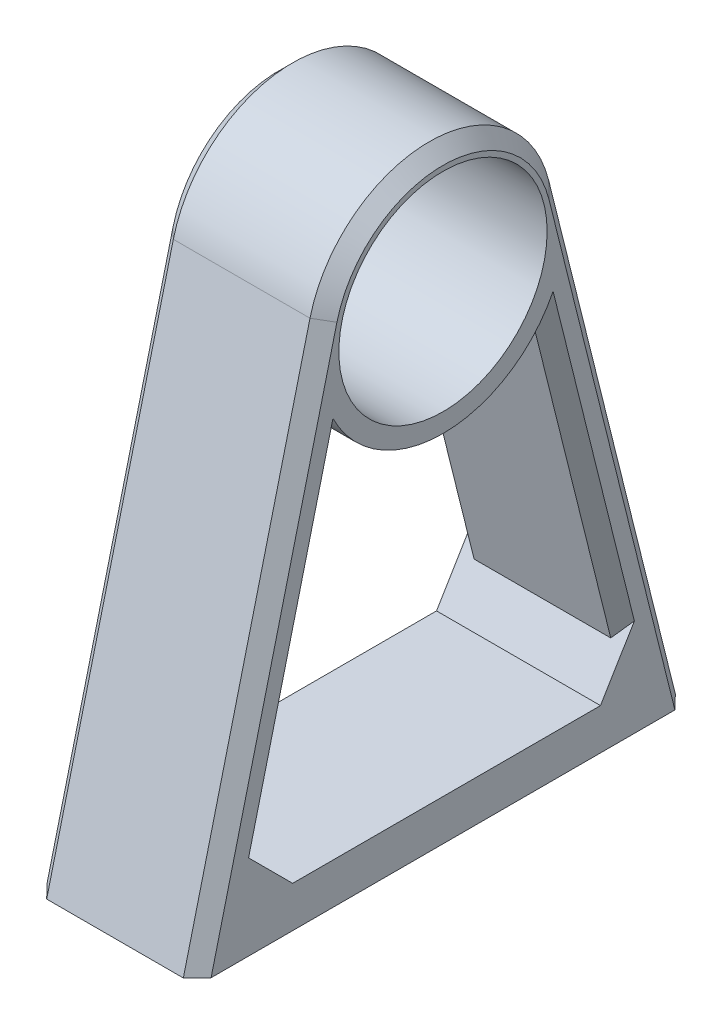
ISO-10303-21;
HEADER;
FILE_DESCRIPTION(('STEP AP214'),'2;1');
FILE_NAME('part.step','',(''),(''),'','','');
FILE_SCHEMA(('AUTOMOTIVE_DESIGN { 1 0 10303 214 1 1 1 1 }'));
ENDSEC;
DATA;
#1=APPLICATION_CONTEXT('core data for automotive mechanical design processes');
#2=APPLICATION_PROTOCOL_DEFINITION('international standard','automotive_design',2000,#1);
#3=PRODUCT_CONTEXT('',#1,'mechanical');
#4=PRODUCT('Part','Part','',(#3));
#5=PRODUCT_RELATED_PRODUCT_CATEGORY('part','',(#4));
#6=PRODUCT_DEFINITION_FORMATION('','',#4);
#7=PRODUCT_DEFINITION_CONTEXT('part definition',#1,'design');
#8=PRODUCT_DEFINITION('design','',#6,#7);
#9=PRODUCT_DEFINITION_SHAPE('','',#8);
#10=(LENGTH_UNIT() NAMED_UNIT(*) SI_UNIT(.MILLI.,.METRE.));
#11=(NAMED_UNIT(*) PLANE_ANGLE_UNIT() SI_UNIT($,.RADIAN.));
#12=(NAMED_UNIT(*) SI_UNIT($,.STERADIAN.) SOLID_ANGLE_UNIT());
#13=UNCERTAINTY_MEASURE_WITH_UNIT(LENGTH_MEASURE(1.E-05),#10,'distance_accuracy_value','');
#14=(GEOMETRIC_REPRESENTATION_CONTEXT(3) GLOBAL_UNCERTAINTY_ASSIGNED_CONTEXT((#13)) GLOBAL_UNIT_ASSIGNED_CONTEXT((#10,
#11,#12)) REPRESENTATION_CONTEXT('',''));
#15=CARTESIAN_POINT('',(0.,0.,0.));
#16=DIRECTION('',(0.,0.,1.));
#17=DIRECTION('',(1.,0.,0.));
#18=AXIS2_PLACEMENT_3D('',#15,#16,#17);
#19=CARTESIAN_POINT('',(30.,7.067986699613,-28.3542726450738));
#20=DIRECTION('',(0.,-0.241872683140122,0.970307994994681));
#21=DIRECTION('',(0.,-0.970307994994681,-0.241872683140122));
#22=AXIS2_PLACEMENT_3D('',#19,#20,#21);
#23=PLANE('',#22);
#24=DIRECTION('',(-1.,0.,0.));
#25=VECTOR('',#24,1.);
#26=CARTESIAN_POINT('',(30.,-26.1369507826166,-36.6314046111677));
#27=LINE('',#26,#25);
#28=CARTESIAN_POINT('',(25.,-26.1369507826166,-36.6314046111677));
#29=VERTEX_POINT('',#28);
#30=CARTESIAN_POINT('',(-24.9999999999999,-26.1369507826166,-36.6314046111677));
#31=VERTEX_POINT('',#30);
#32=EDGE_CURVE('E230',#29,#31,#27,.T.);
#33=ORIENTED_EDGE('',*,*,#32,.T.);
#34=DIRECTION('',(0.,-0.970307994994681,-0.241872683140122));
#35=VECTOR('',#34,1.);
#36=CARTESIAN_POINT('',(-24.9999999999999,-145.44538007508,-66.3719097528982));
#37=LINE('',#36,#35);
#38=CARTESIAN_POINT('',(-24.9999999999999,-145.44538007508,-66.3719097528982));
#39=VERTEX_POINT('',#38);
#40=EDGE_CURVE('E343',#31,#39,#37,.T.);
#41=ORIENTED_EDGE('',*,*,#40,.T.);
#42=DIRECTION('',(1.,0.,0.));
#43=VECTOR('',#42,1.);
#44=CARTESIAN_POINT('',(30.,-145.44538007508,-66.3719097528982));
#45=LINE('',#44,#43);
#46=CARTESIAN_POINT('',(25.,-145.44538007508,-66.3719097528982));
#47=VERTEX_POINT('',#46);
#48=EDGE_CURVE('E211',#39,#47,#45,.T.);
#49=ORIENTED_EDGE('',*,*,#48,.T.);
#50=DIRECTION('',(0.,0.970307994994681,0.241872683140122));
#51=VECTOR('',#50,1.);
#52=CARTESIAN_POINT('',(25.,7.067986699613,-28.3542726450738));
#53=LINE('',#52,#51);
#54=EDGE_CURVE('E340',#47,#29,#53,.T.);
#55=ORIENTED_EDGE('',*,*,#54,.T.);
#56=EDGE_LOOP('',(#33,#41,#49,#55));
#57=FACE_BOUND('',#56,.T.);
#58=ADVANCED_FACE('F55',(#57),#23,.T.);
#59=CARTESIAN_POINT('',(30.,-160.,0.));
#60=DIRECTION('',(0.,-1.,0.));
#61=DIRECTION('',(0.,0.,-1.));
#62=AXIS2_PLACEMENT_3D('',#59,#60,#61);
#63=PLANE('',#62);
#64=DIRECTION('',(0.,0.,1.));
#65=VECTOR('',#64,1.);
#66=CARTESIAN_POINT('',(30.,-160.,0.));
#67=LINE('',#66,#65);
#68=CARTESIAN_POINT('',(30.,-160.,-57.6256070810494));
#69=VERTEX_POINT('',#68);
#70=CARTESIAN_POINT('',(30.,-160.,55.));
#71=VERTEX_POINT('',#70);
#72=EDGE_CURVE('E209',#69,#71,#67,.T.);
#73=ORIENTED_EDGE('',*,*,#72,.F.);
#74=DIRECTION('',(-1.,0.,0.));
#75=VECTOR('',#74,1.);
#76=CARTESIAN_POINT('',(30.,-160.,-57.6256070810494));
#77=LINE('',#76,#75);
#78=CARTESIAN_POINT('',(-30.,-160.,-57.6256070810494));
#79=VERTEX_POINT('',#78);
#80=EDGE_CURVE('E190',#69,#79,#77,.T.);
#81=ORIENTED_EDGE('',*,*,#80,.T.);
#82=DIRECTION('',(0.,0.,1.));
#83=VECTOR('',#82,1.);
#84=CARTESIAN_POINT('',(-30.,-160.,0.));
#85=LINE('',#84,#83);
#86=CARTESIAN_POINT('',(-30.,-160.,55.));
#87=VERTEX_POINT('',#86);
#88=EDGE_CURVE('E206',#79,#87,#85,.T.);
#89=ORIENTED_EDGE('',*,*,#88,.T.);
#90=DIRECTION('',(1.,0.,0.));
#91=VECTOR('',#90,1.);
#92=CARTESIAN_POINT('',(30.,-160.,55.));
#93=LINE('',#92,#91);
#94=EDGE_CURVE('E212',#87,#71,#93,.T.);
#95=ORIENTED_EDGE('',*,*,#94,.T.);
#96=EDGE_LOOP('',(#73,#81,#89,#95));
#97=FACE_BOUND('',#96,.T.);
#98=ADVANCED_FACE('F205',(#97),#63,.F.);
#99=CARTESIAN_POINT('',(30.,7.067986699613,28.3542726450738));
#100=DIRECTION('',(0.,0.241872683140122,0.970307994994681));
#101=DIRECTION('',(0.,-0.970307994994681,0.241872683140122));
#102=AXIS2_PLACEMENT_3D('',#99,#100,#101);
#103=PLANE('',#102);
#104=DIRECTION('',(-1.,0.,0.));
#105=VECTOR('',#104,1.);
#106=CARTESIAN_POINT('',(-30.,-147.993027617537,67.0069723824633));
#107=LINE('',#106,#105);
#108=CARTESIAN_POINT('',(24.9999999999999,-147.993027617537,67.0069723824633));
#109=VERTEX_POINT('',#108);
#110=CARTESIAN_POINT('',(-24.9999999999999,-147.993027617537,67.0069723824633));
#111=VERTEX_POINT('',#110);
#112=EDGE_CURVE('E200',#109,#111,#107,.T.);
#113=ORIENTED_EDGE('',*,*,#112,.T.);
#114=DIRECTION('',(0.,0.970307994994681,-0.241872683140122));
#115=VECTOR('',#114,1.);
#116=CARTESIAN_POINT('',(-24.9999999999999,7.067986699613,28.3542726450738));
#117=LINE('',#116,#115);
#118=CARTESIAN_POINT('',(-24.9999999999999,-26.1369507826167,36.6314046111677));
#119=VERTEX_POINT('',#118);
#120=EDGE_CURVE('E336',#111,#119,#117,.T.);
#121=ORIENTED_EDGE('',*,*,#120,.T.);
#122=DIRECTION('',(-1.,0.,0.));
#123=VECTOR('',#122,1.);
#124=CARTESIAN_POINT('',(30.,-26.1369507826167,36.6314046111677));
#125=LINE('',#124,#123);
#126=CARTESIAN_POINT('',(24.9999999999999,-26.1369507826167,36.6314046111677));
#127=VERTEX_POINT('',#126);
#128=EDGE_CURVE('E233',#127,#119,#125,.T.);
#129=ORIENTED_EDGE('',*,*,#128,.F.);
#130=DIRECTION('',(0.,-0.970307994994681,0.241872683140122));
#131=VECTOR('',#130,1.);
#132=CARTESIAN_POINT('',(24.9999999999999,-147.993027617537,67.0069723824633));
#133=LINE('',#132,#131);
#134=EDGE_CURVE('E333',#127,#109,#133,.T.);
#135=ORIENTED_EDGE('',*,*,#134,.T.);
#136=EDGE_LOOP('',(#113,#121,#129,#135));
#137=FACE_BOUND('',#136,.T.);
#138=ADVANCED_FACE('F458',(#137),#103,.F.);
#139=CARTESIAN_POINT('',(30.,-175.,0.));
#140=DIRECTION('',(0.,-1.,0.));
#141=DIRECTION('',(0.,0.,-1.));
#142=AXIS2_PLACEMENT_3D('',#139,#140,#141);
#143=PLANE('',#142);
#144=DIRECTION('',(-1.,0.,0.));
#145=VECTOR('',#144,1.);
#146=CARTESIAN_POINT('',(30.,-175.,-90.));
#147=LINE('',#146,#145);
#148=CARTESIAN_POINT('',(25.,-175.,-90.));
#149=VERTEX_POINT('',#148);
#150=CARTESIAN_POINT('',(-24.9999999999999,-175.,-90.));
#151=VERTEX_POINT('',#150);
#152=EDGE_CURVE('E234',#149,#151,#147,.T.);
#153=ORIENTED_EDGE('',*,*,#152,.F.);
#154=DIRECTION('',(0.696371807147768,0.,0.71768120095886));
#155=VECTOR('',#154,1.);
#156=CARTESIAN_POINT('',(72.4042344070444,-175.,-41.1451676667838));
#157=LINE('',#156,#155);
#158=CARTESIAN_POINT('',(30.,-175.,-84.846997009411));
#159=VERTEX_POINT('',#158);
#160=EDGE_CURVE('E303',#149,#159,#157,.T.);
#161=ORIENTED_EDGE('',*,*,#160,.T.);
#162=DIRECTION('',(0.,0.,1.));
#163=VECTOR('',#162,1.);
#164=CARTESIAN_POINT('',(30.,-175.,0.));
#165=LINE('',#164,#163);
#166=CARTESIAN_POINT('',(30.,-175.,84.846997009411));
#167=VERTEX_POINT('',#166);
#168=EDGE_CURVE('E223',#159,#167,#165,.T.);
#169=ORIENTED_EDGE('',*,*,#168,.T.);
#170=DIRECTION('',(0.696371807147768,0.,-0.71768120095886));
#171=VECTOR('',#170,1.);
#172=CARTESIAN_POINT('',(72.4042344070444,-175.,41.1451676667838));
#173=LINE('',#172,#171);
#174=CARTESIAN_POINT('',(25.,-175.,90.));
#175=VERTEX_POINT('',#174);
#176=EDGE_CURVE('E300',#167,#175,#173,.F.);
#177=ORIENTED_EDGE('',*,*,#176,.T.);
#178=DIRECTION('',(-1.,0.,0.));
#179=VECTOR('',#178,1.);
#180=CARTESIAN_POINT('',(30.,-175.,90.));
#181=LINE('',#180,#179);
#182=CARTESIAN_POINT('',(-24.9999999999999,-175.,90.));
#183=VERTEX_POINT('',#182);
#184=EDGE_CURVE('E238',#175,#183,#181,.T.);
#185=ORIENTED_EDGE('',*,*,#184,.T.);
#186=DIRECTION('',(-0.696371807147769,0.,-0.717681200958859));
#187=VECTOR('',#186,1.);
#188=CARTESIAN_POINT('',(-43.3082127796294,-175.,71.131544958846));
#189=LINE('',#188,#187);
#190=CARTESIAN_POINT('',(-30.,-175.,84.846997009411));
#191=VERTEX_POINT('',#190);
#192=EDGE_CURVE('E294',#183,#191,#189,.T.);
#193=ORIENTED_EDGE('',*,*,#192,.T.);
#194=DIRECTION('',(0.,0.,1.));
#195=VECTOR('',#194,1.);
#196=CARTESIAN_POINT('',(-30.,-175.,0.));
#197=LINE('',#196,#195);
#198=CARTESIAN_POINT('',(-30.,-175.,-84.846997009411));
#199=VERTEX_POINT('',#198);
#200=EDGE_CURVE('E226',#199,#191,#197,.T.);
#201=ORIENTED_EDGE('',*,*,#200,.F.);
#202=DIRECTION('',(-0.696371807147768,0.,0.71768120095886));
#203=VECTOR('',#202,1.);
#204=CARTESIAN_POINT('',(-43.3082127796295,-175.,-71.1315449588459));
#205=LINE('',#204,#203);
#206=EDGE_CURVE('E297',#199,#151,#205,.F.);
#207=ORIENTED_EDGE('',*,*,#206,.T.);
#208=EDGE_LOOP('',(#153,#161,#169,#177,#185,#193,#201,#207));
#209=FACE_BOUND('',#208,.T.);
#210=ADVANCED_FACE('F395',(#209),#143,.T.);
#211=CARTESIAN_POINT('',(30.,10.8842707413055,-43.6638597747607));
#212=DIRECTION('',(0.,-0.241872683140122,0.970307994994681));
#213=DIRECTION('',(0.,-0.970307994994681,-0.241872683140122));
#214=AXIS2_PLACEMENT_3D('',#211,#212,#213);
#215=PLANE('',#214);
#216=DIRECTION('',(-1.,0.,0.));
#217=VECTOR('',#216,1.);
#218=CARTESIAN_POINT('',(30.,10.8842707413055,-43.6638597747607));
#219=LINE('',#218,#217);
#220=CARTESIAN_POINT('',(25.,10.8842707413055,-43.6638597747607));
#221=VERTEX_POINT('',#220);
#222=CARTESIAN_POINT('',(-24.9999999999999,10.8842707413055,-43.6638597747607));
#223=VERTEX_POINT('',#222);
#224=EDGE_CURVE('E247',#221,#223,#219,.T.);
#225=ORIENTED_EDGE('',*,*,#224,.F.);
#226=DIRECTION('',(0.,-0.970307994994681,-0.241872683140122));
#227=VECTOR('',#226,1.);
#228=CARTESIAN_POINT('',(25.,-175.,-90.));
#229=LINE('',#228,#227);
#230=EDGE_CURVE('E291',#221,#149,#229,.T.);
#231=ORIENTED_EDGE('',*,*,#230,.T.);
#232=ORIENTED_EDGE('',*,*,#152,.T.);
#233=DIRECTION('',(0.,0.970307994994681,0.241872683140122));
#234=VECTOR('',#233,1.);
#235=CARTESIAN_POINT('',(-24.9999999999999,10.8842707413055,-43.6638597747607));
#236=LINE('',#235,#234);
#237=EDGE_CURVE('E287',#151,#223,#236,.T.);
#238=ORIENTED_EDGE('',*,*,#237,.T.);
#239=EDGE_LOOP('',(#225,#231,#232,#238));
#240=FACE_BOUND('',#239,.T.);
#241=ADVANCED_FACE('F411',(#240),#215,.F.);
#242=CARTESIAN_POINT('',(30.,0.,0.));
#243=DIRECTION('',(-1.,0.,0.));
#244=DIRECTION('',(0.,0.,1.));
#245=AXIS2_PLACEMENT_3D('',#242,#243,#244);
#246=CYLINDRICAL_SURFACE('',#245,45.);
#247=DIRECTION('',(-1.,0.,0.));
#248=VECTOR('',#247,1.);
#249=CARTESIAN_POINT('',(30.,10.8842707413055,43.6638597747606));
#250=LINE('',#249,#248);
#251=CARTESIAN_POINT('',(25.,10.8842707413055,43.6638597747606));
#252=VERTEX_POINT('',#251);
#253=CARTESIAN_POINT('',(-24.9999999999999,10.8842707413055,43.6638597747606));
#254=VERTEX_POINT('',#253);
#255=EDGE_CURVE('E242',#252,#254,#250,.T.);
#256=ORIENTED_EDGE('',*,*,#255,.F.);
#257=CARTESIAN_POINT('',(25.,0.,0.));
#258=DIRECTION('',(1.,0.,0.));
#259=DIRECTION('',(0.,0.,-1.));
#260=AXIS2_PLACEMENT_3D('',#257,#258,#259);
#261=CIRCLE('',#260,45.);
#262=EDGE_CURVE('E309',#252,#221,#261,.F.);
#263=ORIENTED_EDGE('',*,*,#262,.T.);
#264=ORIENTED_EDGE('',*,*,#224,.T.);
#265=CARTESIAN_POINT('',(-24.9999999999999,0.,0.));
#266=DIRECTION('',(1.,0.,0.));
#267=DIRECTION('',(0.,0.,-1.));
#268=AXIS2_PLACEMENT_3D('',#265,#266,#267);
#269=CIRCLE('',#268,45.);
#270=EDGE_CURVE('E306',#223,#254,#269,.T.);
#271=ORIENTED_EDGE('',*,*,#270,.T.);
#272=EDGE_LOOP('',(#256,#263,#264,#271));
#273=FACE_BOUND('',#272,.T.);
#274=ADVANCED_FACE('F407',(#273),#246,.T.);
#275=CARTESIAN_POINT('',(30.,0.,0.));
#276=DIRECTION('',(-1.,0.,0.));
#277=DIRECTION('',(0.,0.,1.));
#278=AXIS2_PLACEMENT_3D('',#275,#276,#277);
#279=CYLINDRICAL_SURFACE('',#278,38.1);
#280=CARTESIAN_POINT('',(30.,0.,0.));
#281=DIRECTION('',(1.,0.,0.));
#282=DIRECTION('',(0.,0.,-1.));
#283=AXIS2_PLACEMENT_3D('',#280,#281,#282);
#284=CIRCLE('',#283,38.1);
#285=CARTESIAN_POINT('',(30.,0.,-38.1));
#286=VERTEX_POINT('',#285);
#287=EDGE_CURVE('E424',#286,#286,#284,.T.);
#288=ORIENTED_EDGE('',*,*,#287,.T.);
#289=EDGE_LOOP('',(#288));
#290=FACE_BOUND('',#289,.T.);
#291=CARTESIAN_POINT('',(-30.,0.,0.));
#292=DIRECTION('',(1.,0.,0.));
#293=DIRECTION('',(0.,0.,-1.));
#294=AXIS2_PLACEMENT_3D('',#291,#292,#293);
#295=CIRCLE('',#294,38.1);
#296=CARTESIAN_POINT('',(-30.,0.,-38.1));
#297=VERTEX_POINT('',#296);
#298=EDGE_CURVE('E219',#297,#297,#295,.T.);
#299=ORIENTED_EDGE('',*,*,#298,.F.);
#300=EDGE_LOOP('',(#299));
#301=FACE_BOUND('',#300,.T.);
#302=ADVANCED_FACE('F462',(#290,#301),#279,.F.);
#303=CARTESIAN_POINT('',(30.,10.8842707413055,43.6638597747606));
#304=DIRECTION('',(0.,0.241872683140122,0.970307994994681));
#305=DIRECTION('',(0.,-0.970307994994681,0.241872683140122));
#306=AXIS2_PLACEMENT_3D('',#303,#304,#305);
#307=PLANE('',#306);
#308=ORIENTED_EDGE('',*,*,#184,.F.);
#309=DIRECTION('',(0.,0.970307994994681,-0.241872683140122));
#310=VECTOR('',#309,1.);
#311=CARTESIAN_POINT('',(25.,10.8842707413055,43.6638597747606));
#312=LINE('',#311,#310);
#313=EDGE_CURVE('E315',#175,#252,#312,.T.);
#314=ORIENTED_EDGE('',*,*,#313,.T.);
#315=ORIENTED_EDGE('',*,*,#255,.T.);
#316=DIRECTION('',(0.,-0.970307994994681,0.241872683140122));
#317=VECTOR('',#316,1.);
#318=CARTESIAN_POINT('',(-24.9999999999999,-175.,90.));
#319=LINE('',#318,#317);
#320=EDGE_CURVE('E312',#254,#183,#319,.T.);
#321=ORIENTED_EDGE('',*,*,#320,.T.);
#322=EDGE_LOOP('',(#308,#314,#315,#321));
#323=FACE_BOUND('',#322,.T.);
#324=ADVANCED_FACE('F390',(#323),#307,.T.);
#325=CARTESIAN_POINT('',(30.,0.,0.));
#326=DIRECTION('',(-1.,0.,0.));
#327=DIRECTION('',(0.,0.,1.));
#328=AXIS2_PLACEMENT_3D('',#325,#326,#327);
#329=CYLINDRICAL_SURFACE('',#328,45.);
#330=CARTESIAN_POINT('',(-30.,0.,0.));
#331=DIRECTION('',(1.,0.,0.));
#332=DIRECTION('',(0.,0.,-1.));
#333=AXIS2_PLACEMENT_3D('',#330,#331,#332);
#334=CIRCLE('',#333,45.);
#335=CARTESIAN_POINT('',(-30.,-20.0758976470199,40.2735438429049));
#336=VERTEX_POINT('',#335);
#337=CARTESIAN_POINT('',(-30.,-20.0758976470199,-40.2735438429049));
#338=VERTEX_POINT('',#337);
#339=EDGE_CURVE('E218',#336,#338,#334,.T.);
#340=ORIENTED_EDGE('',*,*,#339,.T.);
#341=CARTESIAN_POINT('',(4.22193034720834,0.,0.));
#342=DIRECTION('',(-0.707106781186547,-0.171029814432165,0.686111363100262));
#343=DIRECTION('',(-0.707106781186548,0.171029814432165,-0.686111363100261));
#344=AXIS2_PLACEMENT_3D('',#341,#342,#343);
#345=ELLIPSE('',#344,63.6396103067893,45.);
#346=EDGE_CURVE('E74',#338,#31,#345,.T.);
#347=ORIENTED_EDGE('',*,*,#346,.T.);
#348=ORIENTED_EDGE('',*,*,#32,.F.);
#349=CARTESIAN_POINT('',(-4.22193034720807,0.,0.));
#350=DIRECTION('',(-0.707106781186549,0.171029814432165,-0.68611136310026));
#351=DIRECTION('',(-0.707106781186546,-0.171029814432166,0.686111363100263));
#352=AXIS2_PLACEMENT_3D('',#349,#350,#351);
#353=ELLIPSE('',#352,63.6396103067891,45.);
#354=CARTESIAN_POINT('',(30.,-20.07589764702,-40.2735438429048));
#355=VERTEX_POINT('',#354);
#356=EDGE_CURVE('E82',#29,#355,#353,.F.);
#357=ORIENTED_EDGE('',*,*,#356,.T.);
#358=CARTESIAN_POINT('',(30.,0.,0.));
#359=DIRECTION('',(1.,0.,0.));
#360=DIRECTION('',(0.,0.,-1.));
#361=AXIS2_PLACEMENT_3D('',#358,#359,#360);
#362=CIRCLE('',#361,45.);
#363=CARTESIAN_POINT('',(30.,-20.0758976470199,40.2735438429049));
#364=VERTEX_POINT('',#363);
#365=EDGE_CURVE('E243',#364,#355,#362,.T.);
#366=ORIENTED_EDGE('',*,*,#365,.F.);
#367=CARTESIAN_POINT('',(-4.22193034720828,0.,0.));
#368=DIRECTION('',(0.707106781186547,-0.171029814432165,-0.686111363100262));
#369=DIRECTION('',(-0.707106781186548,-0.171029814432165,-0.686111363100262));
#370=AXIS2_PLACEMENT_3D('',#367,#368,#369);
#371=ELLIPSE('',#370,63.6396103067893,45.);
#372=EDGE_CURVE('E66',#364,#127,#371,.T.);
#373=ORIENTED_EDGE('',*,*,#372,.T.);
#374=ORIENTED_EDGE('',*,*,#128,.T.);
#375=CARTESIAN_POINT('',(4.22193034720821,0.,0.));
#376=DIRECTION('',(0.707106781186548,0.171029814432165,0.686111363100261));
#377=DIRECTION('',(-0.707106781186547,0.171029814432165,0.686111363100262));
#378=AXIS2_PLACEMENT_3D('',#375,#376,#377);
#379=ELLIPSE('',#378,63.6396103067892,45.);
#380=EDGE_CURVE('E346',#119,#336,#379,.F.);
#381=ORIENTED_EDGE('',*,*,#380,.T.);
#382=EDGE_LOOP('',(#340,#347,#348,#357,#366,#373,#374,#381));
#383=FACE_BOUND('',#382,.T.);
#384=ADVANCED_FACE('F468',(#383),#329,.T.);
#385=CARTESIAN_POINT('',(30.,0.,0.));
#386=DIRECTION('',(1.,0.,0.));
#387=DIRECTION('',(0.,0.,-1.));
#388=AXIS2_PLACEMENT_3D('',#385,#386,#387);
#389=PLANE('',#388);
#390=ORIENTED_EDGE('',*,*,#168,.F.);
#391=DIRECTION('',(0.,0.970307994994681,0.241872683140122));
#392=VECTOR('',#391,1.);
#393=CARTESIAN_POINT('',(30.,9.67490732560487,-38.8123197997872));
#394=LINE('',#393,#392);
#395=CARTESIAN_POINT('',(30.,9.67490732560487,-38.8123197997872));
#396=VERTEX_POINT('',#395);
#397=EDGE_CURVE('E283',#159,#396,#394,.T.);
#398=ORIENTED_EDGE('',*,*,#397,.T.);
#399=CARTESIAN_POINT('',(30.,0.,0.));
#400=DIRECTION('',(1.,0.,0.));
#401=DIRECTION('',(0.,0.,-1.));
#402=AXIS2_PLACEMENT_3D('',#399,#400,#401);
#403=CIRCLE('',#402,40.);
#404=CARTESIAN_POINT('',(30.,9.67490732560486,38.8123197997872));
#405=VERTEX_POINT('',#404);
#406=EDGE_CURVE('E280',#396,#405,#403,.T.);
#407=ORIENTED_EDGE('',*,*,#406,.T.);
#408=DIRECTION('',(0.,-0.970307994994681,0.241872683140122));
#409=VECTOR('',#408,1.);
#410=CARTESIAN_POINT('',(30.,9.67490732560486,38.8123197997872));
#411=LINE('',#410,#409);
#412=EDGE_CURVE('E277',#405,#167,#411,.T.);
#413=ORIENTED_EDGE('',*,*,#412,.T.);
#414=EDGE_LOOP('',(#390,#398,#407,#413));
#415=FACE_BOUND('',#414,.T.);
#416=ORIENTED_EDGE('',*,*,#287,.F.);
#417=EDGE_LOOP('',(#416));
#418=FACE_BOUND('',#417,.T.);
#419=ORIENTED_EDGE('',*,*,#365,.T.);
#420=DIRECTION('',(0.,-0.970307994994681,-0.241872683140122));
#421=VECTOR('',#420,1.);
#422=CARTESIAN_POINT('',(30.,8.27735011531361,-33.2058126200472));
#423=LINE('',#422,#421);
#424=CARTESIAN_POINT('',(30.,-139.384476684406,-70.014086312171));
#425=VERTEX_POINT('',#424);
#426=EDGE_CURVE('E273',#355,#425,#423,.T.);
#427=ORIENTED_EDGE('',*,*,#426,.T.);
#428=DIRECTION('',(0.,-0.857141177532425,0.5150815486681));
#429=VECTOR('',#428,1.);
#430=CARTESIAN_POINT('',(30.,-160.,-57.6256070810494));
#431=LINE('',#430,#429);
#432=EDGE_CURVE('E199',#425,#69,#431,.T.);
#433=ORIENTED_EDGE('',*,*,#432,.T.);
#434=ORIENTED_EDGE('',*,*,#72,.T.);
#435=DIRECTION('',(0.,-0.70710678118655,-0.707106781186545));
#436=VECTOR('',#435,1.);
#437=CARTESIAN_POINT('',(30.,-147.993027617537,67.0069723824633));
#438=LINE('',#437,#436);
#439=CARTESIAN_POINT('',(30.,-143.868229977886,71.1317700221135));
#440=VERTEX_POINT('',#439);
#441=EDGE_CURVE('E266',#71,#440,#438,.F.);
#442=ORIENTED_EDGE('',*,*,#441,.T.);
#443=DIRECTION('',(0.,0.970307994994681,-0.241872683140122));
#444=VECTOR('',#443,1.);
#445=CARTESIAN_POINT('',(30.,-24.927587366916,41.4829445861411));
#446=LINE('',#445,#444);
#447=EDGE_CURVE('E269',#440,#364,#446,.T.);
#448=ORIENTED_EDGE('',*,*,#447,.T.);
#449=EDGE_LOOP('',(#419,#427,#433,#434,#442,#448));
#450=FACE_BOUND('',#449,.T.);
#451=ADVANCED_FACE('F421',(#415,#418,#450),#389,.T.);
#452=CARTESIAN_POINT('',(-30.,0.,0.));
#453=DIRECTION('',(1.,0.,0.));
#454=DIRECTION('',(0.,0.,-1.));
#455=AXIS2_PLACEMENT_3D('',#452,#453,#454);
#456=PLANE('',#455);
#457=CARTESIAN_POINT('',(-30.,0.,0.));
#458=DIRECTION('',(1.,0.,0.));
#459=DIRECTION('',(0.,0.,-1.));
#460=AXIS2_PLACEMENT_3D('',#457,#458,#459);
#461=CIRCLE('',#460,40.);
#462=CARTESIAN_POINT('',(-30.,9.67490732560486,38.8123197997872));
#463=VERTEX_POINT('',#462);
#464=CARTESIAN_POINT('',(-30.,9.67490732560486,-38.8123197997872));
#465=VERTEX_POINT('',#464);
#466=EDGE_CURVE('E327',#463,#465,#461,.F.);
#467=ORIENTED_EDGE('',*,*,#466,.T.);
#468=DIRECTION('',(0.,-0.970307994994681,-0.241872683140122));
#469=VECTOR('',#468,1.);
#470=CARTESIAN_POINT('',(-30.,9.67490732560486,-38.8123197997872));
#471=LINE('',#470,#469);
#472=EDGE_CURVE('E330',#465,#199,#471,.T.);
#473=ORIENTED_EDGE('',*,*,#472,.T.);
#474=ORIENTED_EDGE('',*,*,#200,.T.);
#475=DIRECTION('',(0.,0.970307994994681,-0.241872683140122));
#476=VECTOR('',#475,1.);
#477=CARTESIAN_POINT('',(-30.,9.67490732560486,38.8123197997872));
#478=LINE('',#477,#476);
#479=EDGE_CURVE('E324',#191,#463,#478,.T.);
#480=ORIENTED_EDGE('',*,*,#479,.T.);
#481=EDGE_LOOP('',(#467,#473,#474,#480));
#482=FACE_BOUND('',#481,.T.);
#483=ORIENTED_EDGE('',*,*,#298,.T.);
#484=EDGE_LOOP('',(#483));
#485=FACE_BOUND('',#484,.T.);
#486=ORIENTED_EDGE('',*,*,#339,.F.);
#487=DIRECTION('',(0.,-0.970307994994681,0.241872683140122));
#488=VECTOR('',#487,1.);
#489=CARTESIAN_POINT('',(-30.,8.27735011531362,33.2058126200473));
#490=LINE('',#489,#488);
#491=CARTESIAN_POINT('',(-30.,-143.868229977886,71.1317700221135));
#492=VERTEX_POINT('',#491);
#493=EDGE_CURVE('E321',#336,#492,#490,.T.);
#494=ORIENTED_EDGE('',*,*,#493,.T.);
#495=DIRECTION('',(0.,0.70710678118655,0.707106781186545));
#496=VECTOR('',#495,1.);
#497=CARTESIAN_POINT('',(-30.,-107.499999999999,107.5));
#498=LINE('',#497,#496);
#499=EDGE_CURVE('E216',#492,#87,#498,.F.);
#500=ORIENTED_EDGE('',*,*,#499,.T.);
#501=ORIENTED_EDGE('',*,*,#88,.F.);
#502=DIRECTION('',(0.,0.857141177532425,-0.5150815486681));
#503=VECTOR('',#502,1.);
#504=CARTESIAN_POINT('',(-30.,-67.8910078061654,-112.976631613602));
#505=LINE('',#504,#503);
#506=CARTESIAN_POINT('',(-30.,-139.384476684406,-70.014086312171));
#507=VERTEX_POINT('',#506);
#508=EDGE_CURVE('E187',#79,#507,#505,.T.);
#509=ORIENTED_EDGE('',*,*,#508,.T.);
#510=DIRECTION('',(0.,0.970307994994681,0.241872683140122));
#511=VECTOR('',#510,1.);
#512=CARTESIAN_POINT('',(-30.,-24.927587366916,-41.4829445861411));
#513=LINE('',#512,#511);
#514=EDGE_CURVE('E318',#507,#338,#513,.T.);
#515=ORIENTED_EDGE('',*,*,#514,.T.);
#516=EDGE_LOOP('',(#486,#494,#500,#501,#509,#515));
#517=FACE_BOUND('',#516,.T.);
#518=ADVANCED_FACE('F214',(#482,#485,#517),#456,.F.);
#519=CARTESIAN_POINT('',(30.,-160.,-57.6256070810494));
#520=DIRECTION('',(0.,-0.5150815486681,-0.857141177532425));
#521=DIRECTION('',(-1.,0.,0.));
#522=AXIS2_PLACEMENT_3D('',#519,#520,#521);
#523=PLANE('',#522);
#524=ORIENTED_EDGE('',*,*,#432,.F.);
#525=DIRECTION('',(0.577350269189626,0.69985284082759,-0.420562323386462));
#526=VECTOR('',#525,1.);
#527=CARTESIAN_POINT('',(18.6620184116911,-153.128158894802,-61.7551001580899));
#528=LINE('',#527,#526);
#529=EDGE_CURVE('E359',#425,#47,#528,.F.);
#530=ORIENTED_EDGE('',*,*,#529,.T.);
#531=ORIENTED_EDGE('',*,*,#48,.F.);
#532=DIRECTION('',(-0.577350269189628,0.699852840827588,-0.420562323386461));
#533=VECTOR('',#532,1.);
#534=CARTESIAN_POINT('',(1.33798158830909,-177.371772457498,-47.1863939209986));
#535=LINE('',#534,#533);
#536=EDGE_CURVE('E193',#39,#507,#535,.T.);
#537=ORIENTED_EDGE('',*,*,#536,.T.);
#538=ORIENTED_EDGE('',*,*,#508,.F.);
#539=ORIENTED_EDGE('',*,*,#80,.F.);
#540=EDGE_LOOP('',(#524,#530,#531,#537,#538,#539));
#541=FACE_BOUND('',#540,.T.);
#542=ADVANCED_FACE('F189',(#541),#523,.F.);
#543=CARTESIAN_POINT('',(30.,-147.993027617537,67.0069723824633));
#544=DIRECTION('',(0.,0.707106781186545,-0.70710678118655));
#545=DIRECTION('',(1.,0.,0.));
#546=AXIS2_PLACEMENT_3D('',#543,#544,#545);
#547=PLANE('',#546);
#548=ORIENTED_EDGE('',*,*,#441,.F.);
#549=ORIENTED_EDGE('',*,*,#94,.F.);
#550=ORIENTED_EDGE('',*,*,#499,.F.);
#551=DIRECTION('',(0.650790638307874,-0.536875937759756,-0.536875937759752));
#552=VECTOR('',#551,1.);
#553=CARTESIAN_POINT('',(-1.70593497999563,-167.209688500011,47.7903114999889));
#554=LINE('',#553,#552);
#555=EDGE_CURVE('E350',#492,#111,#554,.T.);
#556=ORIENTED_EDGE('',*,*,#555,.T.);
#557=ORIENTED_EDGE('',*,*,#112,.F.);
#558=DIRECTION('',(-0.650790638307875,-0.536875937759755,-0.536875937759751));
#559=VECTOR('',#558,1.);
#560=CARTESIAN_POINT('',(27.1176422745458,-146.246058446403,68.7539415535973));
#561=LINE('',#560,#559);
#562=EDGE_CURVE('E11',#109,#440,#561,.F.);
#563=ORIENTED_EDGE('',*,*,#562,.T.);
#564=EDGE_LOOP('',(#548,#549,#550,#556,#557,#563));
#565=FACE_BOUND('',#564,.T.);
#566=ADVANCED_FACE('F481',(#565),#547,.T.);
#567=CARTESIAN_POINT('',(25.,10.8842707413055,43.6638597747606));
#568=DIRECTION('',(-0.707106781186546,-0.171029814432165,-0.686111363100263));
#569=DIRECTION('',(0.,0.970307994994681,-0.241872683140122));
#570=AXIS2_PLACEMENT_3D('',#567,#568,#569);
#571=PLANE('',#570);
#572=ORIENTED_EDGE('',*,*,#176,.F.);
#573=ORIENTED_EDGE('',*,*,#412,.F.);
#574=DIRECTION('',(0.707106781186548,-0.171029814432165,-0.686111363100261));
#575=VECTOR('',#574,1.);
#576=CARTESIAN_POINT('',(25.,10.8842707413055,43.6638597747606));
#577=LINE('',#576,#575);
#578=EDGE_CURVE('E367',#252,#405,#577,.T.);
#579=ORIENTED_EDGE('',*,*,#578,.F.);
#580=ORIENTED_EDGE('',*,*,#313,.F.);
#581=EDGE_LOOP('',(#572,#573,#579,#580));
#582=FACE_BOUND('',#581,.T.);
#583=ADVANCED_FACE('F403',(#582),#571,.F.);
#584=CARTESIAN_POINT('',(30.,0.,0.));
#585=DIRECTION('',(-1.,0.,0.));
#586=DIRECTION('',(0.,0.,1.));
#587=AXIS2_PLACEMENT_3D('',#584,#585,#586);
#588=CONICAL_SURFACE('',#587,40.,0.785398163397447);
#589=ORIENTED_EDGE('',*,*,#578,.T.);
#590=ORIENTED_EDGE('',*,*,#406,.F.);
#591=DIRECTION('',(0.707106781186548,-0.171029814432165,0.686111363100261));
#592=VECTOR('',#591,1.);
#593=CARTESIAN_POINT('',(25.,10.8842707413055,-43.6638597747607));
#594=LINE('',#593,#592);
#595=EDGE_CURVE('E364',#221,#396,#594,.T.);
#596=ORIENTED_EDGE('',*,*,#595,.F.);
#597=ORIENTED_EDGE('',*,*,#262,.F.);
#598=EDGE_LOOP('',(#589,#590,#596,#597));
#599=FACE_BOUND('',#598,.T.);
#600=ADVANCED_FACE('F419',(#599),#588,.T.);
#601=CARTESIAN_POINT('',(30.,9.67490732560487,-38.8123197997872));
#602=DIRECTION('',(0.707106781186546,0.171029814432165,-0.686111363100263));
#603=DIRECTION('',(0.,-0.970307994994681,-0.241872683140122));
#604=AXIS2_PLACEMENT_3D('',#601,#602,#603);
#605=PLANE('',#604);
#606=ORIENTED_EDGE('',*,*,#160,.F.);
#607=ORIENTED_EDGE('',*,*,#230,.F.);
#608=ORIENTED_EDGE('',*,*,#595,.T.);
#609=ORIENTED_EDGE('',*,*,#397,.F.);
#610=EDGE_LOOP('',(#606,#607,#608,#609));
#611=FACE_BOUND('',#610,.T.);
#612=ADVANCED_FACE('F415',(#611),#605,.T.);
#613=CARTESIAN_POINT('',(-30.,9.67490732560486,38.8123197997872));
#614=DIRECTION('',(-0.707106781186546,0.171029814432166,0.686111363100263));
#615=DIRECTION('',(0.,-0.970307994994681,0.241872683140122));
#616=AXIS2_PLACEMENT_3D('',#613,#614,#615);
#617=PLANE('',#616);
#618=ORIENTED_EDGE('',*,*,#192,.F.);
#619=ORIENTED_EDGE('',*,*,#320,.F.);
#620=DIRECTION('',(0.707106781186548,0.171029814432165,0.686111363100261));
#621=VECTOR('',#620,1.);
#622=CARTESIAN_POINT('',(-30.,9.67490732560486,38.8123197997872));
#623=LINE('',#622,#621);
#624=EDGE_CURVE('E60',#463,#254,#623,.T.);
#625=ORIENTED_EDGE('',*,*,#624,.F.);
#626=ORIENTED_EDGE('',*,*,#479,.F.);
#627=EDGE_LOOP('',(#618,#619,#625,#626));
#628=FACE_BOUND('',#627,.T.);
#629=ADVANCED_FACE('F387',(#628),#617,.T.);
#630=CARTESIAN_POINT('',(-24.9999999999999,0.,0.));
#631=DIRECTION('',(1.,0.,0.));
#632=DIRECTION('',(0.,0.,-1.));
#633=AXIS2_PLACEMENT_3D('',#630,#631,#632);
#634=CONICAL_SURFACE('',#633,45.,0.785398163397447);
#635=ORIENTED_EDGE('',*,*,#624,.T.);
#636=ORIENTED_EDGE('',*,*,#270,.F.);
#637=DIRECTION('',(0.707106781186547,0.171029814432165,-0.686111363100262));
#638=VECTOR('',#637,1.);
#639=CARTESIAN_POINT('',(-30.,9.67490732560486,-38.8123197997872));
#640=LINE('',#639,#638);
#641=EDGE_CURVE('E370',#465,#223,#640,.T.);
#642=ORIENTED_EDGE('',*,*,#641,.F.);
#643=ORIENTED_EDGE('',*,*,#466,.F.);
#644=EDGE_LOOP('',(#635,#636,#642,#643));
#645=FACE_BOUND('',#644,.T.);
#646=ADVANCED_FACE('F382',(#645),#634,.T.);
#647=CARTESIAN_POINT('',(-24.9999999999999,10.8842707413055,-43.6638597747607));
#648=DIRECTION('',(0.707106781186547,-0.171029814432165,0.686111363100263));
#649=DIRECTION('',(0.,0.970307994994681,0.241872683140122));
#650=AXIS2_PLACEMENT_3D('',#647,#648,#649);
#651=PLANE('',#650);
#652=ORIENTED_EDGE('',*,*,#206,.F.);
#653=ORIENTED_EDGE('',*,*,#472,.F.);
#654=ORIENTED_EDGE('',*,*,#641,.T.);
#655=ORIENTED_EDGE('',*,*,#237,.F.);
#656=EDGE_LOOP('',(#652,#653,#654,#655));
#657=FACE_BOUND('',#656,.T.);
#658=ADVANCED_FACE('F437',(#657),#651,.F.);
#659=CARTESIAN_POINT('',(-24.9999999999999,7.067986699613,28.3542726450738));
#660=DIRECTION('',(0.707106781186548,0.171029814432165,0.686111363100261));
#661=DIRECTION('',(0.,0.970307994994681,-0.241872683140122));
#662=AXIS2_PLACEMENT_3D('',#659,#660,#661);
#663=PLANE('',#662);
#664=ORIENTED_EDGE('',*,*,#555,.F.);
#665=ORIENTED_EDGE('',*,*,#493,.F.);
#666=ORIENTED_EDGE('',*,*,#380,.F.);
#667=ORIENTED_EDGE('',*,*,#120,.F.);
#668=EDGE_LOOP('',(#664,#665,#666,#667));
#669=FACE_BOUND('',#668,.T.);
#670=ADVANCED_FACE('F439',(#669),#663,.F.);
#671=CARTESIAN_POINT('',(-30.,8.27735011531363,-33.2058126200473));
#672=DIRECTION('',(-0.707106781186547,-0.171029814432165,0.686111363100262));
#673=DIRECTION('',(0.,-0.970307994994681,-0.241872683140122));
#674=AXIS2_PLACEMENT_3D('',#671,#672,#673);
#675=PLANE('',#674);
#676=ORIENTED_EDGE('',*,*,#536,.F.);
#677=ORIENTED_EDGE('',*,*,#40,.F.);
#678=ORIENTED_EDGE('',*,*,#346,.F.);
#679=ORIENTED_EDGE('',*,*,#514,.F.);
#680=EDGE_LOOP('',(#676,#677,#678,#679));
#681=FACE_BOUND('',#680,.T.);
#682=ADVANCED_FACE('F445',(#681),#675,.T.);
#683=CARTESIAN_POINT('',(25.,7.067986699613,-28.3542726450738));
#684=DIRECTION('',(-0.707106781186549,0.171029814432165,-0.68611136310026));
#685=DIRECTION('',(0.,0.970307994994681,0.241872683140122));
#686=AXIS2_PLACEMENT_3D('',#683,#684,#685);
#687=PLANE('',#686);
#688=ORIENTED_EDGE('',*,*,#529,.F.);
#689=ORIENTED_EDGE('',*,*,#426,.F.);
#690=ORIENTED_EDGE('',*,*,#356,.F.);
#691=ORIENTED_EDGE('',*,*,#54,.F.);
#692=EDGE_LOOP('',(#688,#689,#690,#691));
#693=FACE_BOUND('',#692,.T.);
#694=ADVANCED_FACE('F540',(#693),#687,.F.);
#695=CARTESIAN_POINT('',(30.,8.27735011531362,33.2058126200473));
#696=DIRECTION('',(0.707106781186547,-0.171029814432165,-0.686111363100262));
#697=DIRECTION('',(0.,-0.970307994994681,0.241872683140122));
#698=AXIS2_PLACEMENT_3D('',#695,#696,#697);
#699=PLANE('',#698);
#700=ORIENTED_EDGE('',*,*,#562,.F.);
#701=ORIENTED_EDGE('',*,*,#134,.F.);
#702=ORIENTED_EDGE('',*,*,#372,.F.);
#703=ORIENTED_EDGE('',*,*,#447,.F.);
#704=EDGE_LOOP('',(#700,#701,#702,#703));
#705=FACE_BOUND('',#704,.T.);
#706=ADVANCED_FACE('F58',(#705),#699,.T.);
#707=CLOSED_SHELL('',(#58,#98,#138,#210,#241,#274,#302,#324,#384,#451,#518,#542,#566,#583,#600,
#612,#629,#646,#658,#670,#682,#694,#706));
#708=MANIFOLD_SOLID_BREP('B2',#707);
#709=ADVANCED_BREP_SHAPE_REPRESENTATION('',(#18,#708),#14);
#710=SHAPE_DEFINITION_REPRESENTATION(#9,#709);
ENDSEC;
END-ISO-10303-21;
